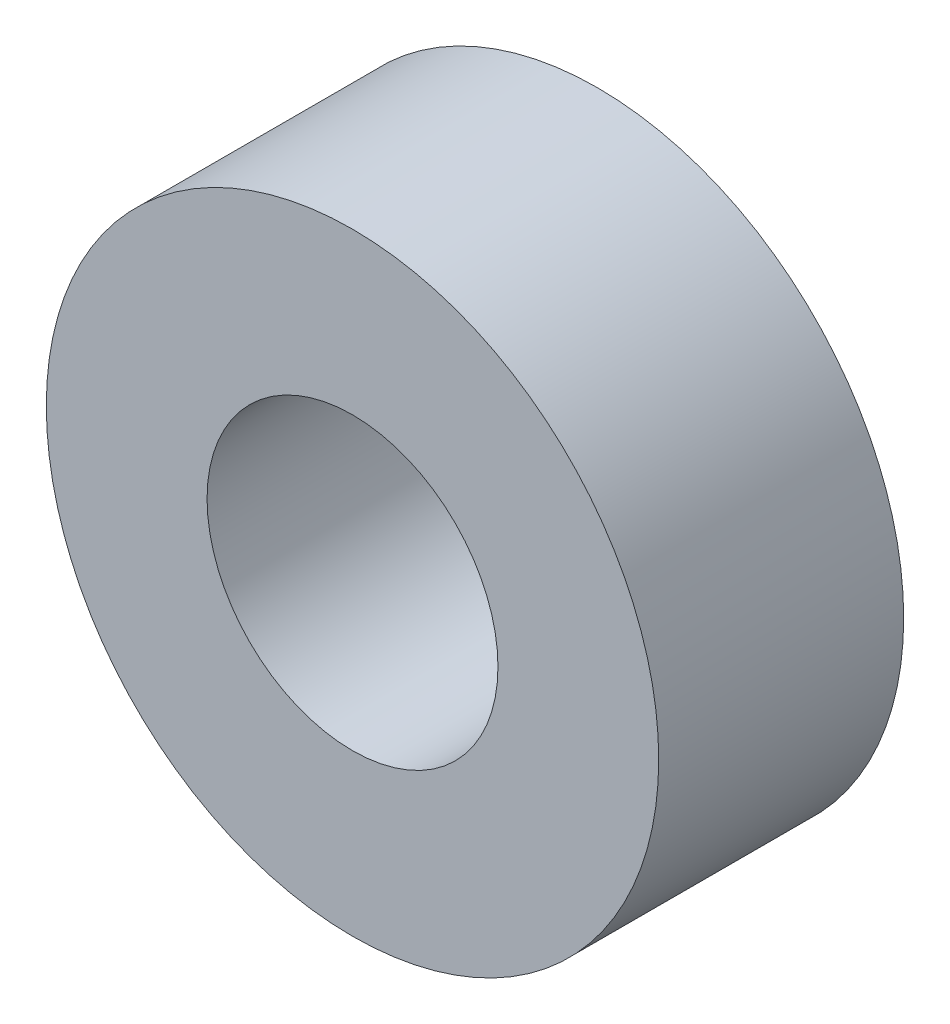
ISO-10303-21;
HEADER;
FILE_DESCRIPTION(('STEP AP214'),'2;1');
FILE_NAME('part.step','',(''),(''),'','','');
FILE_SCHEMA(('AUTOMOTIVE_DESIGN { 1 0 10303 214 1 1 1 1 }'));
ENDSEC;
DATA;
#1=APPLICATION_CONTEXT('core data for automotive mechanical design processes');
#2=APPLICATION_PROTOCOL_DEFINITION('international standard','automotive_design',2000,#1);
#3=PRODUCT_CONTEXT('',#1,'mechanical');
#4=PRODUCT('Part','Part','',(#3));
#5=PRODUCT_RELATED_PRODUCT_CATEGORY('part','',(#4));
#6=PRODUCT_DEFINITION_FORMATION('','',#4);
#7=PRODUCT_DEFINITION_CONTEXT('part definition',#1,'design');
#8=PRODUCT_DEFINITION('design','',#6,#7);
#9=PRODUCT_DEFINITION_SHAPE('','',#8);
#10=(LENGTH_UNIT() NAMED_UNIT(*) SI_UNIT(.MILLI.,.METRE.));
#11=(NAMED_UNIT(*) PLANE_ANGLE_UNIT() SI_UNIT($,.RADIAN.));
#12=(NAMED_UNIT(*) SI_UNIT($,.STERADIAN.) SOLID_ANGLE_UNIT());
#13=UNCERTAINTY_MEASURE_WITH_UNIT(LENGTH_MEASURE(1.E-05),#10,'distance_accuracy_value','');
#14=(GEOMETRIC_REPRESENTATION_CONTEXT(3) GLOBAL_UNCERTAINTY_ASSIGNED_CONTEXT((#13)) GLOBAL_UNIT_ASSIGNED_CONTEXT((#10,
#11,#12)) REPRESENTATION_CONTEXT('',''));
#15=CARTESIAN_POINT('',(0.,0.,0.));
#16=DIRECTION('',(0.,0.,1.));
#17=DIRECTION('',(1.,0.,0.));
#18=AXIS2_PLACEMENT_3D('',#15,#16,#17);
#19=CARTESIAN_POINT('',(0.,0.,8.));
#20=DIRECTION('',(0.,0.,1.));
#21=DIRECTION('',(1.,0.,0.));
#22=AXIS2_PLACEMENT_3D('',#19,#20,#21);
#23=PLANE('',#22);
#24=CARTESIAN_POINT('',(0.,0.,8.));
#25=DIRECTION('',(0.,0.,1.));
#26=DIRECTION('',(1.,0.,0.));
#27=AXIS2_PLACEMENT_3D('',#24,#25,#26);
#28=CIRCLE('',#27,10.);
#29=CARTESIAN_POINT('',(10.,0.,8.));
#30=VERTEX_POINT('',#29);
#31=EDGE_CURVE('E10',#30,#30,#28,.T.);
#32=ORIENTED_EDGE('',*,*,#31,.T.);
#33=EDGE_LOOP('',(#32));
#34=FACE_BOUND('',#33,.T.);
#35=CARTESIAN_POINT('',(0.,0.,8.));
#36=DIRECTION('',(0.,0.,1.));
#37=DIRECTION('',(1.,0.,0.));
#38=AXIS2_PLACEMENT_3D('',#35,#36,#37);
#39=CIRCLE('',#38,4.75);
#40=CARTESIAN_POINT('',(4.75,0.,8.));
#41=VERTEX_POINT('',#40);
#42=EDGE_CURVE('E50',#41,#41,#39,.T.);
#43=ORIENTED_EDGE('',*,*,#42,.F.);
#44=EDGE_LOOP('',(#43));
#45=FACE_BOUND('',#44,.T.);
#46=ADVANCED_FACE('F37',(#34,#45),#23,.T.);
#47=CARTESIAN_POINT('',(0.,0.,0.));
#48=DIRECTION('',(0.,0.,1.));
#49=DIRECTION('',(1.,0.,0.));
#50=AXIS2_PLACEMENT_3D('',#47,#48,#49);
#51=PLANE('',#50);
#52=CARTESIAN_POINT('',(0.,0.,0.));
#53=DIRECTION('',(0.,0.,1.));
#54=DIRECTION('',(1.,0.,0.));
#55=AXIS2_PLACEMENT_3D('',#52,#53,#54);
#56=CIRCLE('',#55,10.);
#57=CARTESIAN_POINT('',(10.,0.,0.));
#58=VERTEX_POINT('',#57);
#59=EDGE_CURVE('E41',#58,#58,#56,.T.);
#60=ORIENTED_EDGE('',*,*,#59,.F.);
#61=EDGE_LOOP('',(#60));
#62=FACE_BOUND('',#61,.T.);
#63=CARTESIAN_POINT('',(0.,0.,0.));
#64=DIRECTION('',(0.,0.,1.));
#65=DIRECTION('',(1.,0.,0.));
#66=AXIS2_PLACEMENT_3D('',#63,#64,#65);
#67=CIRCLE('',#66,4.75);
#68=CARTESIAN_POINT('',(4.75,0.,0.));
#69=VERTEX_POINT('',#68);
#70=EDGE_CURVE('E52',#69,#69,#67,.T.);
#71=ORIENTED_EDGE('',*,*,#70,.T.);
#72=EDGE_LOOP('',(#71));
#73=FACE_BOUND('',#72,.T.);
#74=ADVANCED_FACE('F64',(#62,#73),#51,.F.);
#75=CARTESIAN_POINT('',(0.,0.,8.));
#76=DIRECTION('',(0.,0.,-1.));
#77=DIRECTION('',(-1.,0.,0.));
#78=AXIS2_PLACEMENT_3D('',#75,#76,#77);
#79=CYLINDRICAL_SURFACE('',#78,10.);
#80=ORIENTED_EDGE('',*,*,#31,.F.);
#81=EDGE_LOOP('',(#80));
#82=FACE_BOUND('',#81,.T.);
#83=ORIENTED_EDGE('',*,*,#59,.T.);
#84=EDGE_LOOP('',(#83));
#85=FACE_BOUND('',#84,.T.);
#86=ADVANCED_FACE('F39',(#82,#85),#79,.T.);
#87=CARTESIAN_POINT('',(0.,0.,8.));
#88=DIRECTION('',(0.,0.,-1.));
#89=DIRECTION('',(-1.,0.,0.));
#90=AXIS2_PLACEMENT_3D('',#87,#88,#89);
#91=CYLINDRICAL_SURFACE('',#90,4.75);
#92=ORIENTED_EDGE('',*,*,#42,.T.);
#93=EDGE_LOOP('',(#92));
#94=FACE_BOUND('',#93,.T.);
#95=ORIENTED_EDGE('',*,*,#70,.F.);
#96=EDGE_LOOP('',(#95));
#97=FACE_BOUND('',#96,.T.);
#98=ADVANCED_FACE('F60',(#94,#97),#91,.F.);
#99=CLOSED_SHELL('',(#46,#74,#86,#98));
#100=MANIFOLD_SOLID_BREP('B2',#99);
#101=ADVANCED_BREP_SHAPE_REPRESENTATION('',(#18,#100),#14);
#102=SHAPE_DEFINITION_REPRESENTATION(#9,#101);
ENDSEC;
END-ISO-10303-21;
